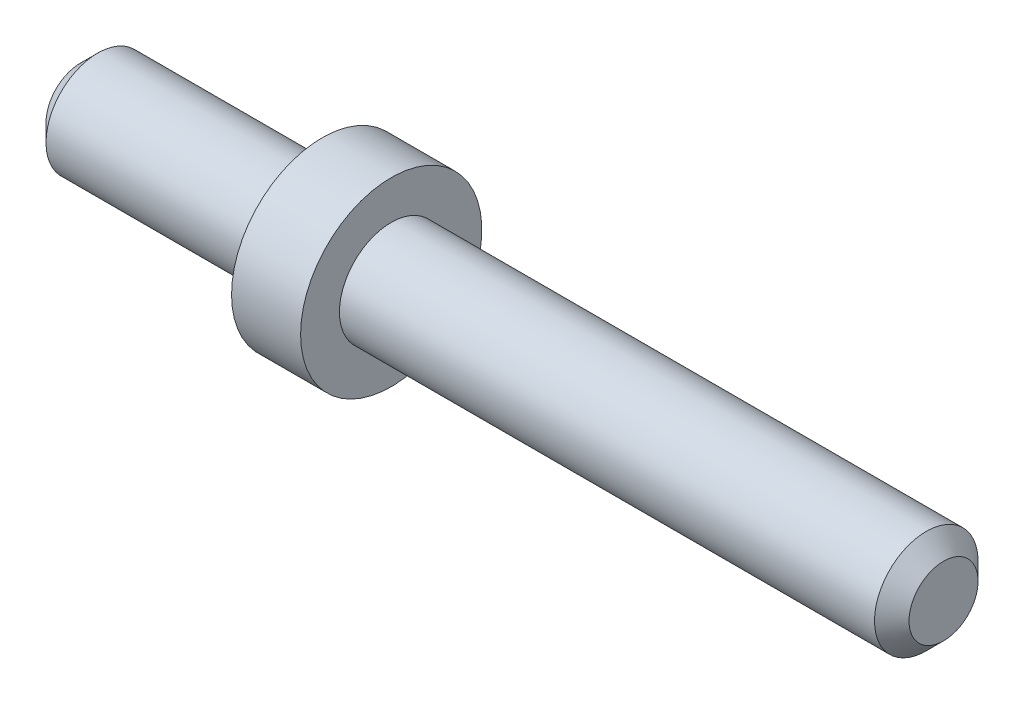
ISO-10303-21;
HEADER;
FILE_DESCRIPTION(('STEP AP214'),'2;1');
FILE_NAME('part.step','',(''),(''),'','','');
FILE_SCHEMA(('AUTOMOTIVE_DESIGN { 1 0 10303 214 1 1 1 1 }'));
ENDSEC;
DATA;
#1=APPLICATION_CONTEXT('core data for automotive mechanical design processes');
#2=APPLICATION_PROTOCOL_DEFINITION('international standard','automotive_design',2000,#1);
#3=PRODUCT_CONTEXT('',#1,'mechanical');
#4=PRODUCT('Part','Part','',(#3));
#5=PRODUCT_RELATED_PRODUCT_CATEGORY('part','',(#4));
#6=PRODUCT_DEFINITION_FORMATION('','',#4);
#7=PRODUCT_DEFINITION_CONTEXT('part definition',#1,'design');
#8=PRODUCT_DEFINITION('design','',#6,#7);
#9=PRODUCT_DEFINITION_SHAPE('','',#8);
#10=(LENGTH_UNIT() NAMED_UNIT(*) SI_UNIT(.MILLI.,.METRE.));
#11=(NAMED_UNIT(*) PLANE_ANGLE_UNIT() SI_UNIT($,.RADIAN.));
#12=(NAMED_UNIT(*) SI_UNIT($,.STERADIAN.) SOLID_ANGLE_UNIT());
#13=UNCERTAINTY_MEASURE_WITH_UNIT(LENGTH_MEASURE(1.E-05),#10,'distance_accuracy_value','');
#14=(GEOMETRIC_REPRESENTATION_CONTEXT(3) GLOBAL_UNCERTAINTY_ASSIGNED_CONTEXT((#13)) GLOBAL_UNIT_ASSIGNED_CONTEXT((#10,
#11,#12)) REPRESENTATION_CONTEXT('',''));
#15=CARTESIAN_POINT('',(0.,0.,0.));
#16=DIRECTION('',(0.,0.,1.));
#17=DIRECTION('',(1.,0.,0.));
#18=AXIS2_PLACEMENT_3D('',#15,#16,#17);
#19=CARTESIAN_POINT('',(0.,0.,0.));
#20=DIRECTION('',(1.,0.,0.));
#21=DIRECTION('',(0.,0.,-1.));
#22=AXIS2_PLACEMENT_3D('',#19,#20,#21);
#23=PLANE('',#22);
#24=CARTESIAN_POINT('',(0.,0.,0.));
#25=DIRECTION('',(-1.,0.,0.));
#26=DIRECTION('',(0.,0.,1.));
#27=AXIS2_PLACEMENT_3D('',#24,#25,#26);
#28=CIRCLE('',#27,2.);
#29=CARTESIAN_POINT('',(0.,0.,2.));
#30=VERTEX_POINT('',#29);
#31=EDGE_CURVE('E10',#30,#30,#28,.T.);
#32=ORIENTED_EDGE('',*,*,#31,.T.);
#33=EDGE_LOOP('',(#32));
#34=FACE_BOUND('',#33,.T.);
#35=ADVANCED_FACE('F34',(#34),#23,.F.);
#36=CARTESIAN_POINT('',(0.999999999999997,0.,0.));
#37=DIRECTION('',(1.,0.,0.));
#38=DIRECTION('',(0.,0.,-1.));
#39=AXIS2_PLACEMENT_3D('',#36,#37,#38);
#40=CONICAL_SURFACE('',#39,3.,0.78539816339745);
#41=ORIENTED_EDGE('',*,*,#31,.F.);
#42=EDGE_LOOP('',(#41));
#43=FACE_BOUND('',#42,.T.);
#44=CARTESIAN_POINT('',(0.999999999999997,0.,0.));
#45=DIRECTION('',(-1.,0.,0.));
#46=DIRECTION('',(0.,0.,1.));
#47=AXIS2_PLACEMENT_3D('',#44,#45,#46);
#48=CIRCLE('',#47,3.);
#49=CARTESIAN_POINT('',(0.999999999999997,0.,3.));
#50=VERTEX_POINT('',#49);
#51=EDGE_CURVE('E40',#50,#50,#48,.T.);
#52=ORIENTED_EDGE('',*,*,#51,.T.);
#53=EDGE_LOOP('',(#52));
#54=FACE_BOUND('',#53,.T.);
#55=ADVANCED_FACE('F78',(#43,#54),#40,.T.);
#56=CARTESIAN_POINT('',(0.,0.,0.));
#57=DIRECTION('',(-1.,0.,0.));
#58=DIRECTION('',(0.,0.,1.));
#59=AXIS2_PLACEMENT_3D('',#56,#57,#58);
#60=CYLINDRICAL_SURFACE('',#59,3.);
#61=ORIENTED_EDGE('',*,*,#51,.F.);
#62=EDGE_LOOP('',(#61));
#63=FACE_BOUND('',#62,.T.);
#64=CARTESIAN_POINT('',(14.,0.,0.));
#65=DIRECTION('',(-1.,0.,0.));
#66=DIRECTION('',(0.,0.,1.));
#67=AXIS2_PLACEMENT_3D('',#64,#65,#66);
#68=CIRCLE('',#67,3.);
#69=CARTESIAN_POINT('',(14.,0.,3.));
#70=VERTEX_POINT('',#69);
#71=EDGE_CURVE('E44',#70,#70,#68,.T.);
#72=ORIENTED_EDGE('',*,*,#71,.T.);
#73=EDGE_LOOP('',(#72));
#74=FACE_BOUND('',#73,.T.);
#75=ADVANCED_FACE('F82',(#63,#74),#60,.T.);
#76=CARTESIAN_POINT('',(14.,3.,0.));
#77=DIRECTION('',(1.,0.,0.));
#78=DIRECTION('',(0.,0.,-1.));
#79=AXIS2_PLACEMENT_3D('',#76,#77,#78);
#80=PLANE('',#79);
#81=ORIENTED_EDGE('',*,*,#71,.F.);
#82=EDGE_LOOP('',(#81));
#83=FACE_BOUND('',#82,.T.);
#84=CARTESIAN_POINT('',(14.,0.,0.));
#85=DIRECTION('',(-1.,0.,0.));
#86=DIRECTION('',(0.,0.,1.));
#87=AXIS2_PLACEMENT_3D('',#84,#85,#86);
#88=CIRCLE('',#87,5.25);
#89=CARTESIAN_POINT('',(14.,0.,5.25));
#90=VERTEX_POINT('',#89);
#91=EDGE_CURVE('E48',#90,#90,#88,.T.);
#92=ORIENTED_EDGE('',*,*,#91,.T.);
#93=EDGE_LOOP('',(#92));
#94=FACE_BOUND('',#93,.T.);
#95=ADVANCED_FACE('F87',(#83,#94),#80,.F.);
#96=CARTESIAN_POINT('',(0.,0.,0.));
#97=DIRECTION('',(-1.,0.,0.));
#98=DIRECTION('',(0.,0.,1.));
#99=AXIS2_PLACEMENT_3D('',#96,#97,#98);
#100=CYLINDRICAL_SURFACE('',#99,5.25);
#101=ORIENTED_EDGE('',*,*,#91,.F.);
#102=EDGE_LOOP('',(#101));
#103=FACE_BOUND('',#102,.T.);
#104=CARTESIAN_POINT('',(18.,0.,0.));
#105=DIRECTION('',(-1.,0.,0.));
#106=DIRECTION('',(0.,0.,1.));
#107=AXIS2_PLACEMENT_3D('',#104,#105,#106);
#108=CIRCLE('',#107,5.25);
#109=CARTESIAN_POINT('',(18.,0.,5.25));
#110=VERTEX_POINT('',#109);
#111=EDGE_CURVE('E53',#110,#110,#108,.T.);
#112=ORIENTED_EDGE('',*,*,#111,.T.);
#113=EDGE_LOOP('',(#112));
#114=FACE_BOUND('',#113,.T.);
#115=ADVANCED_FACE('F93',(#103,#114),#100,.T.);
#116=CARTESIAN_POINT('',(18.,5.25,0.));
#117=DIRECTION('',(-1.,0.,0.));
#118=DIRECTION('',(0.,0.,1.));
#119=AXIS2_PLACEMENT_3D('',#116,#117,#118);
#120=PLANE('',#119);
#121=ORIENTED_EDGE('',*,*,#111,.F.);
#122=EDGE_LOOP('',(#121));
#123=FACE_BOUND('',#122,.T.);
#124=CARTESIAN_POINT('',(18.,0.,0.));
#125=DIRECTION('',(-1.,0.,0.));
#126=DIRECTION('',(0.,0.,1.));
#127=AXIS2_PLACEMENT_3D('',#124,#125,#126);
#128=CIRCLE('',#127,3.);
#129=CARTESIAN_POINT('',(18.,0.,3.));
#130=VERTEX_POINT('',#129);
#131=EDGE_CURVE('E56',#130,#130,#128,.T.);
#132=ORIENTED_EDGE('',*,*,#131,.T.);
#133=EDGE_LOOP('',(#132));
#134=FACE_BOUND('',#133,.T.);
#135=ADVANCED_FACE('F97',(#123,#134),#120,.F.);
#136=CARTESIAN_POINT('',(0.,0.,0.));
#137=DIRECTION('',(-1.,0.,0.));
#138=DIRECTION('',(0.,0.,1.));
#139=AXIS2_PLACEMENT_3D('',#136,#137,#138);
#140=CYLINDRICAL_SURFACE('',#139,3.);
#141=ORIENTED_EDGE('',*,*,#131,.F.);
#142=EDGE_LOOP('',(#141));
#143=FACE_BOUND('',#142,.T.);
#144=CARTESIAN_POINT('',(49.,0.,0.));
#145=DIRECTION('',(-1.,0.,0.));
#146=DIRECTION('',(0.,0.,1.));
#147=AXIS2_PLACEMENT_3D('',#144,#145,#146);
#148=CIRCLE('',#147,3.);
#149=CARTESIAN_POINT('',(49.,0.,3.));
#150=VERTEX_POINT('',#149);
#151=EDGE_CURVE('E59',#150,#150,#148,.T.);
#152=ORIENTED_EDGE('',*,*,#151,.T.);
#153=EDGE_LOOP('',(#152));
#154=FACE_BOUND('',#153,.T.);
#155=ADVANCED_FACE('F74',(#143,#154),#140,.T.);
#156=CARTESIAN_POINT('',(50.,0.,0.));
#157=DIRECTION('',(-1.,0.,0.));
#158=DIRECTION('',(0.,0.,1.));
#159=AXIS2_PLACEMENT_3D('',#156,#157,#158);
#160=CONICAL_SURFACE('',#159,2.,0.785398163397446);
#161=ORIENTED_EDGE('',*,*,#151,.F.);
#162=EDGE_LOOP('',(#161));
#163=FACE_BOUND('',#162,.T.);
#164=CARTESIAN_POINT('',(50.,0.,0.));
#165=DIRECTION('',(-1.,0.,0.));
#166=DIRECTION('',(0.,0.,1.));
#167=AXIS2_PLACEMENT_3D('',#164,#165,#166);
#168=CIRCLE('',#167,2.);
#169=CARTESIAN_POINT('',(50.,0.,2.));
#170=VERTEX_POINT('',#169);
#171=EDGE_CURVE('E62',#170,#170,#168,.T.);
#172=ORIENTED_EDGE('',*,*,#171,.T.);
#173=EDGE_LOOP('',(#172));
#174=FACE_BOUND('',#173,.T.);
#175=ADVANCED_FACE('F66',(#163,#174),#160,.T.);
#176=CARTESIAN_POINT('',(50.,2.,0.));
#177=DIRECTION('',(-1.,0.,0.));
#178=DIRECTION('',(0.,0.,1.));
#179=AXIS2_PLACEMENT_3D('',#176,#177,#178);
#180=PLANE('',#179);
#181=ORIENTED_EDGE('',*,*,#171,.F.);
#182=EDGE_LOOP('',(#181));
#183=FACE_BOUND('',#182,.T.);
#184=ADVANCED_FACE('F68',(#183),#180,.F.);
#185=CLOSED_SHELL('',(#35,#55,#75,#95,#115,#135,#155,#175,#184));
#186=MANIFOLD_SOLID_BREP('B2',#185);
#187=ADVANCED_BREP_SHAPE_REPRESENTATION('',(#18,#186),#14);
#188=SHAPE_DEFINITION_REPRESENTATION(#9,#187);
ENDSEC;
END-ISO-10303-21;
